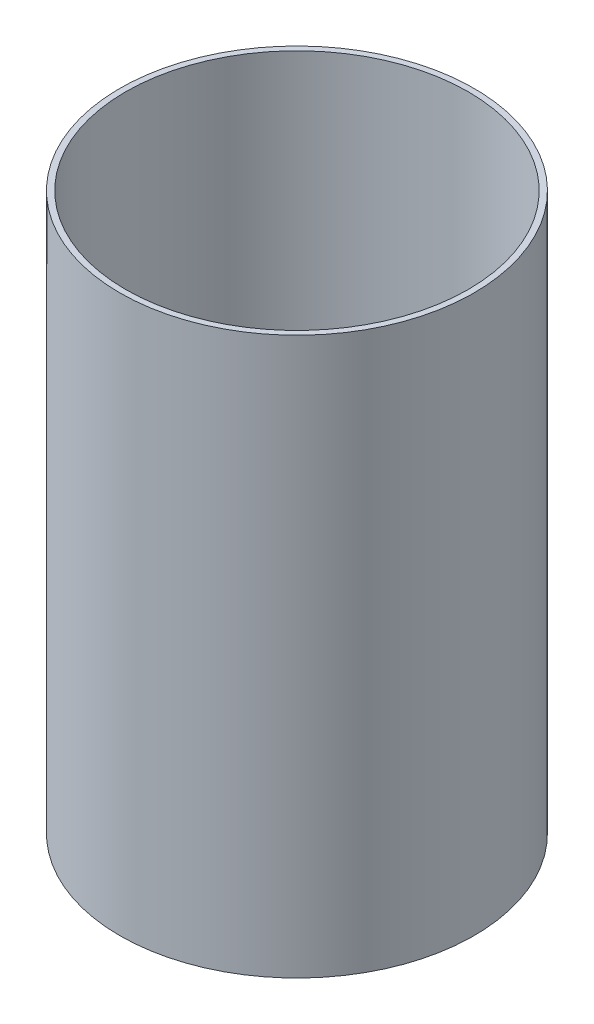
ISO-10303-21;
HEADER;
FILE_DESCRIPTION(('STEP AP214'),'2;1');
FILE_NAME('part.step','',(''),(''),'','','');
FILE_SCHEMA(('AUTOMOTIVE_DESIGN { 1 0 10303 214 1 1 1 1 }'));
ENDSEC;
DATA;
#1=APPLICATION_CONTEXT('core data for automotive mechanical design processes');
#2=APPLICATION_PROTOCOL_DEFINITION('international standard','automotive_design',2000,#1);
#3=PRODUCT_CONTEXT('',#1,'mechanical');
#4=PRODUCT('Part','Part','',(#3));
#5=PRODUCT_RELATED_PRODUCT_CATEGORY('part','',(#4));
#6=PRODUCT_DEFINITION_FORMATION('','',#4);
#7=PRODUCT_DEFINITION_CONTEXT('part definition',#1,'design');
#8=PRODUCT_DEFINITION('design','',#6,#7);
#9=PRODUCT_DEFINITION_SHAPE('','',#8);
#10=(LENGTH_UNIT() NAMED_UNIT(*) SI_UNIT(.MILLI.,.METRE.));
#11=(NAMED_UNIT(*) PLANE_ANGLE_UNIT() SI_UNIT($,.RADIAN.));
#12=(NAMED_UNIT(*) SI_UNIT($,.STERADIAN.) SOLID_ANGLE_UNIT());
#13=UNCERTAINTY_MEASURE_WITH_UNIT(LENGTH_MEASURE(1.E-05),#10,'distance_accuracy_value','');
#14=(GEOMETRIC_REPRESENTATION_CONTEXT(3) GLOBAL_UNCERTAINTY_ASSIGNED_CONTEXT((#13)) GLOBAL_UNIT_ASSIGNED_CONTEXT((#10,
#11,#12)) REPRESENTATION_CONTEXT('',''));
#15=CARTESIAN_POINT('',(0.,0.,0.));
#16=DIRECTION('',(0.,0.,1.));
#17=DIRECTION('',(1.,0.,0.));
#18=AXIS2_PLACEMENT_3D('',#15,#16,#17);
#19=CARTESIAN_POINT('',(0.,143.,0.));
#20=DIRECTION('',(0.,1.,0.));
#21=DIRECTION('',(0.,0.,1.));
#22=AXIS2_PLACEMENT_3D('',#19,#20,#21);
#23=PLANE('',#22);
#24=CARTESIAN_POINT('',(0.,143.,0.));
#25=DIRECTION('',(0.,1.,0.));
#26=DIRECTION('',(0.,0.,1.));
#27=AXIS2_PLACEMENT_3D('',#24,#25,#26);
#28=CIRCLE('',#27,45.5);
#29=CARTESIAN_POINT('',(0.,143.,45.5));
#30=VERTEX_POINT('',#29);
#31=EDGE_CURVE('E12',#30,#30,#28,.T.);
#32=ORIENTED_EDGE('',*,*,#31,.T.);
#33=EDGE_LOOP('',(#32));
#34=FACE_BOUND('',#33,.T.);
#35=CARTESIAN_POINT('',(0.,143.,0.));
#36=DIRECTION('',(0.,1.,0.));
#37=DIRECTION('',(0.,0.,1.));
#38=AXIS2_PLACEMENT_3D('',#35,#36,#37);
#39=CIRCLE('',#38,44.);
#40=CARTESIAN_POINT('',(0.,143.,44.));
#41=VERTEX_POINT('',#40);
#42=EDGE_CURVE('E54',#41,#41,#39,.T.);
#43=ORIENTED_EDGE('',*,*,#42,.F.);
#44=EDGE_LOOP('',(#43));
#45=FACE_BOUND('',#44,.T.);
#46=ADVANCED_FACE('F43',(#34,#45),#23,.T.);
#47=CARTESIAN_POINT('',(0.,0.,0.));
#48=DIRECTION('',(0.,1.,0.));
#49=DIRECTION('',(0.,0.,1.));
#50=AXIS2_PLACEMENT_3D('',#47,#48,#49);
#51=PLANE('',#50);
#52=CARTESIAN_POINT('',(0.,0.,0.));
#53=DIRECTION('',(0.,1.,0.));
#54=DIRECTION('',(0.,0.,1.));
#55=AXIS2_PLACEMENT_3D('',#52,#53,#54);
#56=CIRCLE('',#55,45.5);
#57=CARTESIAN_POINT('',(0.,0.,45.5));
#58=VERTEX_POINT('',#57);
#59=EDGE_CURVE('E47',#58,#58,#56,.T.);
#60=ORIENTED_EDGE('',*,*,#59,.F.);
#61=EDGE_LOOP('',(#60));
#62=FACE_BOUND('',#61,.T.);
#63=CARTESIAN_POINT('',(0.,0.,0.));
#64=DIRECTION('',(0.,1.,0.));
#65=DIRECTION('',(0.,0.,1.));
#66=AXIS2_PLACEMENT_3D('',#63,#64,#65);
#67=CIRCLE('',#66,44.);
#68=CARTESIAN_POINT('',(0.,0.,44.));
#69=VERTEX_POINT('',#68);
#70=EDGE_CURVE('E56',#69,#69,#67,.T.);
#71=ORIENTED_EDGE('',*,*,#70,.T.);
#72=EDGE_LOOP('',(#71));
#73=FACE_BOUND('',#72,.T.);
#74=ADVANCED_FACE('F66',(#62,#73),#51,.F.);
#75=CARTESIAN_POINT('',(0.,143.,0.));
#76=DIRECTION('',(0.,-1.,0.));
#77=DIRECTION('',(0.,0.,-1.));
#78=AXIS2_PLACEMENT_3D('',#75,#76,#77);
#79=CYLINDRICAL_SURFACE('',#78,45.5);
#80=ORIENTED_EDGE('',*,*,#31,.F.);
#81=EDGE_LOOP('',(#80));
#82=FACE_BOUND('',#81,.T.);
#83=ORIENTED_EDGE('',*,*,#59,.T.);
#84=EDGE_LOOP('',(#83));
#85=FACE_BOUND('',#84,.T.);
#86=ADVANCED_FACE('F45',(#82,#85),#79,.T.);
#87=CARTESIAN_POINT('',(0.,143.,0.));
#88=DIRECTION('',(0.,-1.,0.));
#89=DIRECTION('',(0.,0.,-1.));
#90=AXIS2_PLACEMENT_3D('',#87,#88,#89);
#91=CYLINDRICAL_SURFACE('',#90,44.);
#92=ORIENTED_EDGE('',*,*,#42,.T.);
#93=EDGE_LOOP('',(#92));
#94=FACE_BOUND('',#93,.T.);
#95=ORIENTED_EDGE('',*,*,#70,.F.);
#96=EDGE_LOOP('',(#95));
#97=FACE_BOUND('',#96,.T.);
#98=ADVANCED_FACE('F62',(#94,#97),#91,.F.);
#99=CLOSED_SHELL('',(#46,#74,#86,#98));
#100=MANIFOLD_SOLID_BREP('B2',#99);
#101=ADVANCED_BREP_SHAPE_REPRESENTATION('',(#18,#100),#14);
#102=SHAPE_DEFINITION_REPRESENTATION(#9,#101);
ENDSEC;
END-ISO-10303-21;
